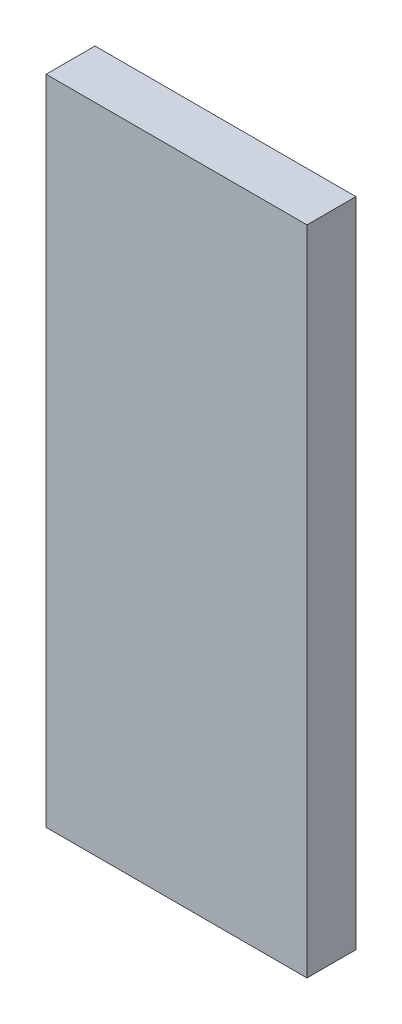
ISO-10303-21;
HEADER;
FILE_DESCRIPTION(('STEP AP214'),'2;1');
FILE_NAME('part.step','',(''),(''),'','','');
FILE_SCHEMA(('AUTOMOTIVE_DESIGN { 1 0 10303 214 1 1 1 1 }'));
ENDSEC;
DATA;
#1=APPLICATION_CONTEXT('core data for automotive mechanical design processes');
#2=APPLICATION_PROTOCOL_DEFINITION('international standard','automotive_design',2000,#1);
#3=PRODUCT_CONTEXT('',#1,'mechanical');
#4=PRODUCT('Part','Part','',(#3));
#5=PRODUCT_RELATED_PRODUCT_CATEGORY('part','',(#4));
#6=PRODUCT_DEFINITION_FORMATION('','',#4);
#7=PRODUCT_DEFINITION_CONTEXT('part definition',#1,'design');
#8=PRODUCT_DEFINITION('design','',#6,#7);
#9=PRODUCT_DEFINITION_SHAPE('','',#8);
#10=(LENGTH_UNIT() NAMED_UNIT(*) SI_UNIT(.MILLI.,.METRE.));
#11=(NAMED_UNIT(*) PLANE_ANGLE_UNIT() SI_UNIT($,.RADIAN.));
#12=(NAMED_UNIT(*) SI_UNIT($,.STERADIAN.) SOLID_ANGLE_UNIT());
#13=UNCERTAINTY_MEASURE_WITH_UNIT(LENGTH_MEASURE(1.E-05),#10,'distance_accuracy_value','');
#14=(GEOMETRIC_REPRESENTATION_CONTEXT(3) GLOBAL_UNCERTAINTY_ASSIGNED_CONTEXT((#13)) GLOBAL_UNIT_ASSIGNED_CONTEXT((#10,
#11,#12)) REPRESENTATION_CONTEXT('',''));
#15=CARTESIAN_POINT('',(0.,0.,0.));
#16=DIRECTION('',(0.,0.,1.));
#17=DIRECTION('',(1.,0.,0.));
#18=AXIS2_PLACEMENT_3D('',#15,#16,#17);
#19=CARTESIAN_POINT('',(-12.,0.,4.5));
#20=DIRECTION('',(1.,0.,0.));
#21=DIRECTION('',(0.,0.,-1.));
#22=AXIS2_PLACEMENT_3D('',#19,#20,#21);
#23=PLANE('',#22);
#24=DIRECTION('',(0.,-1.,0.));
#25=VECTOR('',#24,1.);
#26=CARTESIAN_POINT('',(-12.,0.,0.));
#27=LINE('',#26,#25);
#28=CARTESIAN_POINT('',(-12.,60.,0.));
#29=VERTEX_POINT('',#28);
#30=CARTESIAN_POINT('',(-12.,0.,0.));
#31=VERTEX_POINT('',#30);
#32=EDGE_CURVE('E112',#29,#31,#27,.T.);
#33=ORIENTED_EDGE('',*,*,#32,.T.);
#34=DIRECTION('',(0.,0.,-1.));
#35=VECTOR('',#34,1.);
#36=CARTESIAN_POINT('',(-12.,0.,4.5));
#37=LINE('',#36,#35);
#38=CARTESIAN_POINT('',(-12.,0.,4.5));
#39=VERTEX_POINT('',#38);
#40=EDGE_CURVE('E11',#39,#31,#37,.T.);
#41=ORIENTED_EDGE('',*,*,#40,.F.);
#42=DIRECTION('',(0.,-1.,0.));
#43=VECTOR('',#42,1.);
#44=CARTESIAN_POINT('',(-12.,0.,4.5));
#45=LINE('',#44,#43);
#46=CARTESIAN_POINT('',(-12.,60.,4.5));
#47=VERTEX_POINT('',#46);
#48=EDGE_CURVE('E94',#47,#39,#45,.T.);
#49=ORIENTED_EDGE('',*,*,#48,.F.);
#50=DIRECTION('',(0.,0.,-1.));
#51=VECTOR('',#50,1.);
#52=CARTESIAN_POINT('',(-12.,60.,4.5));
#53=LINE('',#52,#51);
#54=EDGE_CURVE('E108',#47,#29,#53,.T.);
#55=ORIENTED_EDGE('',*,*,#54,.T.);
#56=EDGE_LOOP('',(#33,#41,#49,#55));
#57=FACE_BOUND('',#56,.T.);
#58=ADVANCED_FACE('F43',(#57),#23,.F.);
#59=CARTESIAN_POINT('',(12.,0.,4.5));
#60=DIRECTION('',(0.,1.,0.));
#61=DIRECTION('',(0.,0.,1.));
#62=AXIS2_PLACEMENT_3D('',#59,#60,#61);
#63=PLANE('',#62);
#64=DIRECTION('',(1.,0.,0.));
#65=VECTOR('',#64,1.);
#66=CARTESIAN_POINT('',(12.,0.,0.));
#67=LINE('',#66,#65);
#68=CARTESIAN_POINT('',(12.,0.,0.));
#69=VERTEX_POINT('',#68);
#70=EDGE_CURVE('E100',#31,#69,#67,.T.);
#71=ORIENTED_EDGE('',*,*,#70,.T.);
#72=DIRECTION('',(0.,0.,-1.));
#73=VECTOR('',#72,1.);
#74=CARTESIAN_POINT('',(12.,0.,4.5));
#75=LINE('',#74,#73);
#76=CARTESIAN_POINT('',(12.,0.,4.5));
#77=VERTEX_POINT('',#76);
#78=EDGE_CURVE('E52',#77,#69,#75,.T.);
#79=ORIENTED_EDGE('',*,*,#78,.F.);
#80=DIRECTION('',(1.,0.,0.));
#81=VECTOR('',#80,1.);
#82=CARTESIAN_POINT('',(12.,0.,4.5));
#83=LINE('',#82,#81);
#84=EDGE_CURVE('E88',#39,#77,#83,.T.);
#85=ORIENTED_EDGE('',*,*,#84,.F.);
#86=ORIENTED_EDGE('',*,*,#40,.T.);
#87=EDGE_LOOP('',(#71,#79,#85,#86));
#88=FACE_BOUND('',#87,.T.);
#89=ADVANCED_FACE('F99',(#88),#63,.F.);
#90=CARTESIAN_POINT('',(12.,0.,4.5));
#91=DIRECTION('',(-1.,0.,0.));
#92=DIRECTION('',(0.,0.,1.));
#93=AXIS2_PLACEMENT_3D('',#90,#91,#92);
#94=PLANE('',#93);
#95=DIRECTION('',(0.,1.,0.));
#96=VECTOR('',#95,1.);
#97=CARTESIAN_POINT('',(12.,0.,0.));
#98=LINE('',#97,#96);
#99=CARTESIAN_POINT('',(12.,60.,0.));
#100=VERTEX_POINT('',#99);
#101=EDGE_CURVE('E118',#69,#100,#98,.T.);
#102=ORIENTED_EDGE('',*,*,#101,.T.);
#103=DIRECTION('',(0.,0.,-1.));
#104=VECTOR('',#103,1.);
#105=CARTESIAN_POINT('',(12.,60.,4.5));
#106=LINE('',#105,#104);
#107=CARTESIAN_POINT('',(12.,60.,4.5));
#108=VERTEX_POINT('',#107);
#109=EDGE_CURVE('E103',#108,#100,#106,.T.);
#110=ORIENTED_EDGE('',*,*,#109,.F.);
#111=DIRECTION('',(0.,1.,0.));
#112=VECTOR('',#111,1.);
#113=CARTESIAN_POINT('',(12.,0.,4.5));
#114=LINE('',#113,#112);
#115=EDGE_CURVE('E91',#77,#108,#114,.T.);
#116=ORIENTED_EDGE('',*,*,#115,.F.);
#117=ORIENTED_EDGE('',*,*,#78,.T.);
#118=EDGE_LOOP('',(#102,#110,#116,#117));
#119=FACE_BOUND('',#118,.T.);
#120=ADVANCED_FACE('F104',(#119),#94,.F.);
#121=CARTESIAN_POINT('',(-12.,60.,4.5));
#122=DIRECTION('',(0.,-1.,0.));
#123=DIRECTION('',(0.,0.,-1.));
#124=AXIS2_PLACEMENT_3D('',#121,#122,#123);
#125=PLANE('',#124);
#126=DIRECTION('',(-1.,0.,0.));
#127=VECTOR('',#126,1.);
#128=CARTESIAN_POINT('',(-12.,60.,0.));
#129=LINE('',#128,#127);
#130=EDGE_CURVE('E77',#100,#29,#129,.T.);
#131=ORIENTED_EDGE('',*,*,#130,.T.);
#132=ORIENTED_EDGE('',*,*,#54,.F.);
#133=DIRECTION('',(-1.,0.,0.));
#134=VECTOR('',#133,1.);
#135=CARTESIAN_POINT('',(12.,60.,4.5));
#136=LINE('',#135,#134);
#137=EDGE_CURVE('E60',#108,#47,#136,.T.);
#138=ORIENTED_EDGE('',*,*,#137,.F.);
#139=ORIENTED_EDGE('',*,*,#109,.T.);
#140=EDGE_LOOP('',(#131,#132,#138,#139));
#141=FACE_BOUND('',#140,.T.);
#142=ADVANCED_FACE('F126',(#141),#125,.F.);
#143=CARTESIAN_POINT('',(0.,0.,4.5));
#144=DIRECTION('',(0.,0.,-1.));
#145=DIRECTION('',(-1.,0.,0.));
#146=AXIS2_PLACEMENT_3D('',#143,#144,#145);
#147=PLANE('',#146);
#148=ORIENTED_EDGE('',*,*,#48,.T.);
#149=ORIENTED_EDGE('',*,*,#84,.T.);
#150=ORIENTED_EDGE('',*,*,#115,.T.);
#151=ORIENTED_EDGE('',*,*,#137,.T.);
#152=EDGE_LOOP('',(#148,#149,#150,#151));
#153=FACE_BOUND('',#152,.T.);
#154=ADVANCED_FACE('F89',(#153),#147,.F.);
#155=CARTESIAN_POINT('',(0.,0.,0.));
#156=DIRECTION('',(0.,0.,-1.));
#157=DIRECTION('',(-1.,0.,0.));
#158=AXIS2_PLACEMENT_3D('',#155,#156,#157);
#159=PLANE('',#158);
#160=ORIENTED_EDGE('',*,*,#32,.F.);
#161=ORIENTED_EDGE('',*,*,#130,.F.);
#162=ORIENTED_EDGE('',*,*,#101,.F.);
#163=ORIENTED_EDGE('',*,*,#70,.F.);
#164=EDGE_LOOP('',(#160,#161,#162,#163));
#165=FACE_BOUND('',#164,.T.);
#166=ADVANCED_FACE('F129',(#165),#159,.T.);
#167=CLOSED_SHELL('',(#58,#89,#120,#142,#154,#166));
#168=MANIFOLD_SOLID_BREP('B2',#167);
#169=ADVANCED_BREP_SHAPE_REPRESENTATION('',(#18,#168),#14);
#170=SHAPE_DEFINITION_REPRESENTATION(#9,#169);
ENDSEC;
END-ISO-10303-21;
